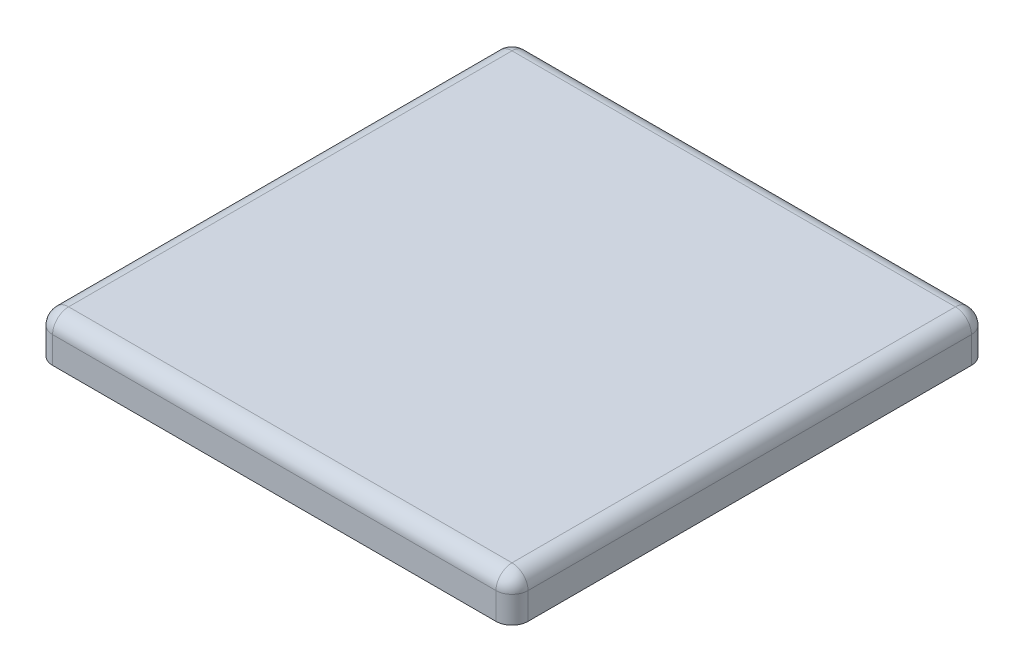
ISO-10303-21;
HEADER;
FILE_DESCRIPTION(('STEP AP214'),'2;1');
FILE_NAME('part.step','',(''),(''),'','','');
FILE_SCHEMA(('AUTOMOTIVE_DESIGN { 1 0 10303 214 1 1 1 1 }'));
ENDSEC;
DATA;
#1=APPLICATION_CONTEXT('core data for automotive mechanical design processes');
#2=APPLICATION_PROTOCOL_DEFINITION('international standard','automotive_design',2000,#1);
#3=PRODUCT_CONTEXT('',#1,'mechanical');
#4=PRODUCT('Part','Part','',(#3));
#5=PRODUCT_RELATED_PRODUCT_CATEGORY('part','',(#4));
#6=PRODUCT_DEFINITION_FORMATION('','',#4);
#7=PRODUCT_DEFINITION_CONTEXT('part definition',#1,'design');
#8=PRODUCT_DEFINITION('design','',#6,#7);
#9=PRODUCT_DEFINITION_SHAPE('','',#8);
#10=(LENGTH_UNIT() NAMED_UNIT(*) SI_UNIT(.MILLI.,.METRE.));
#11=(NAMED_UNIT(*) PLANE_ANGLE_UNIT() SI_UNIT($,.RADIAN.));
#12=(NAMED_UNIT(*) SI_UNIT($,.STERADIAN.) SOLID_ANGLE_UNIT());
#13=UNCERTAINTY_MEASURE_WITH_UNIT(LENGTH_MEASURE(1.E-05),#10,'distance_accuracy_value','');
#14=(GEOMETRIC_REPRESENTATION_CONTEXT(3) GLOBAL_UNCERTAINTY_ASSIGNED_CONTEXT((#13)) GLOBAL_UNIT_ASSIGNED_CONTEXT((#10,
#11,#12)) REPRESENTATION_CONTEXT('',''));
#15=CARTESIAN_POINT('',(0.,0.,0.));
#16=DIRECTION('',(0.,0.,1.));
#17=DIRECTION('',(1.,0.,0.));
#18=AXIS2_PLACEMENT_3D('',#15,#16,#17);
#19=CARTESIAN_POINT('',(0.,0.,0.));
#20=DIRECTION('',(0.,-1.,0.));
#21=DIRECTION('',(0.,0.,-1.));
#22=AXIS2_PLACEMENT_3D('',#19,#20,#21);
#23=PLANE('',#22);
#24=DIRECTION('',(0.,0.,1.));
#25=VECTOR('',#24,1.);
#26=CARTESIAN_POINT('',(-44.5,0.,-44.5));
#27=LINE('',#26,#25);
#28=CARTESIAN_POINT('',(-44.5,0.,-41.5));
#29=VERTEX_POINT('',#28);
#30=CARTESIAN_POINT('',(-44.5,0.,41.5));
#31=VERTEX_POINT('',#30);
#32=EDGE_CURVE('E246',#29,#31,#27,.T.);
#33=ORIENTED_EDGE('',*,*,#32,.F.);
#34=CARTESIAN_POINT('',(-41.5,0.,-41.5));
#35=DIRECTION('',(0.,-1.,0.));
#36=DIRECTION('',(0.,0.,-1.));
#37=AXIS2_PLACEMENT_3D('',#34,#35,#36);
#38=CIRCLE('',#37,3.);
#39=CARTESIAN_POINT('',(-41.5,0.,-44.5));
#40=VERTEX_POINT('',#39);
#41=EDGE_CURVE('E11',#29,#40,#38,.T.);
#42=ORIENTED_EDGE('',*,*,#41,.T.);
#43=DIRECTION('',(-1.,0.,0.));
#44=VECTOR('',#43,1.);
#45=CARTESIAN_POINT('',(44.5,0.,-44.5));
#46=LINE('',#45,#44);
#47=CARTESIAN_POINT('',(41.5,0.,-44.5));
#48=VERTEX_POINT('',#47);
#49=EDGE_CURVE('E255',#48,#40,#46,.T.);
#50=ORIENTED_EDGE('',*,*,#49,.F.);
#51=CARTESIAN_POINT('',(41.5,0.,-41.5));
#52=DIRECTION('',(0.,-1.,0.));
#53=DIRECTION('',(0.,0.,-1.));
#54=AXIS2_PLACEMENT_3D('',#51,#52,#53);
#55=CIRCLE('',#54,3.);
#56=CARTESIAN_POINT('',(44.5,0.,-41.5));
#57=VERTEX_POINT('',#56);
#58=EDGE_CURVE('E293',#48,#57,#55,.T.);
#59=ORIENTED_EDGE('',*,*,#58,.T.);
#60=DIRECTION('',(0.,0.,-1.));
#61=VECTOR('',#60,1.);
#62=CARTESIAN_POINT('',(44.5,0.,-44.5));
#63=LINE('',#62,#61);
#64=CARTESIAN_POINT('',(44.5,0.,41.5));
#65=VERTEX_POINT('',#64);
#66=EDGE_CURVE('E252',#65,#57,#63,.T.);
#67=ORIENTED_EDGE('',*,*,#66,.F.);
#68=CARTESIAN_POINT('',(41.5,0.,41.5));
#69=DIRECTION('',(0.,-1.,0.));
#70=DIRECTION('',(0.,0.,-1.));
#71=AXIS2_PLACEMENT_3D('',#68,#69,#70);
#72=CIRCLE('',#71,3.);
#73=CARTESIAN_POINT('',(41.5,0.,44.5));
#74=VERTEX_POINT('',#73);
#75=EDGE_CURVE('E291',#65,#74,#72,.T.);
#76=ORIENTED_EDGE('',*,*,#75,.T.);
#77=DIRECTION('',(1.,0.,0.));
#78=VECTOR('',#77,1.);
#79=CARTESIAN_POINT('',(44.5,0.,44.5));
#80=LINE('',#79,#78);
#81=CARTESIAN_POINT('',(-41.5,0.,44.5));
#82=VERTEX_POINT('',#81);
#83=EDGE_CURVE('E249',#82,#74,#80,.T.);
#84=ORIENTED_EDGE('',*,*,#83,.F.);
#85=CARTESIAN_POINT('',(-41.5,0.,41.5));
#86=DIRECTION('',(0.,-1.,0.));
#87=DIRECTION('',(0.,0.,-1.));
#88=AXIS2_PLACEMENT_3D('',#85,#86,#87);
#89=CIRCLE('',#88,3.);
#90=EDGE_CURVE('E43',#82,#31,#89,.T.);
#91=ORIENTED_EDGE('',*,*,#90,.T.);
#92=EDGE_LOOP('',(#33,#42,#50,#59,#67,#76,#84,#91));
#93=FACE_BOUND('',#92,.T.);
#94=CARTESIAN_POINT('',(-41.5,0.,-41.5));
#95=DIRECTION('',(0.,-1.,0.));
#96=DIRECTION('',(0.,0.,-1.));
#97=AXIS2_PLACEMENT_3D('',#94,#95,#96);
#98=CIRCLE('',#97,1.);
#99=CARTESIAN_POINT('',(-42.5,0.,-41.5));
#100=VERTEX_POINT('',#99);
#101=CARTESIAN_POINT('',(-41.5,0.,-42.5));
#102=VERTEX_POINT('',#101);
#103=EDGE_CURVE('E230',#100,#102,#98,.T.);
#104=ORIENTED_EDGE('',*,*,#103,.F.);
#105=DIRECTION('',(0.,0.,1.));
#106=VECTOR('',#105,1.);
#107=CARTESIAN_POINT('',(-42.5,0.,0.));
#108=LINE('',#107,#106);
#109=CARTESIAN_POINT('',(-42.5,0.,41.5));
#110=VERTEX_POINT('',#109);
#111=EDGE_CURVE('E191',#100,#110,#108,.T.);
#112=ORIENTED_EDGE('',*,*,#111,.T.);
#113=CARTESIAN_POINT('',(-41.5,0.,41.5));
#114=DIRECTION('',(0.,-1.,0.));
#115=DIRECTION('',(0.,0.,-1.));
#116=AXIS2_PLACEMENT_3D('',#113,#114,#115);
#117=CIRCLE('',#116,1.);
#118=CARTESIAN_POINT('',(-41.5,0.,42.5));
#119=VERTEX_POINT('',#118);
#120=EDGE_CURVE('E233',#119,#110,#117,.T.);
#121=ORIENTED_EDGE('',*,*,#120,.F.);
#122=DIRECTION('',(1.,0.,0.));
#123=VECTOR('',#122,1.);
#124=CARTESIAN_POINT('',(0.,0.,42.5));
#125=LINE('',#124,#123);
#126=CARTESIAN_POINT('',(41.5,0.,42.5));
#127=VERTEX_POINT('',#126);
#128=EDGE_CURVE('E51',#119,#127,#125,.T.);
#129=ORIENTED_EDGE('',*,*,#128,.T.);
#130=CARTESIAN_POINT('',(41.5,0.,41.5));
#131=DIRECTION('',(0.,-1.,0.));
#132=DIRECTION('',(0.,0.,-1.));
#133=AXIS2_PLACEMENT_3D('',#130,#131,#132);
#134=CIRCLE('',#133,1.);
#135=CARTESIAN_POINT('',(42.5,0.,41.5));
#136=VERTEX_POINT('',#135);
#137=EDGE_CURVE('E195',#136,#127,#134,.T.);
#138=ORIENTED_EDGE('',*,*,#137,.F.);
#139=DIRECTION('',(0.,0.,-1.));
#140=VECTOR('',#139,1.);
#141=CARTESIAN_POINT('',(42.5,0.,0.));
#142=LINE('',#141,#140);
#143=CARTESIAN_POINT('',(42.5,0.,-41.5));
#144=VERTEX_POINT('',#143);
#145=EDGE_CURVE('E238',#136,#144,#142,.T.);
#146=ORIENTED_EDGE('',*,*,#145,.T.);
#147=CARTESIAN_POINT('',(41.5,0.,-41.5));
#148=DIRECTION('',(0.,-1.,0.));
#149=DIRECTION('',(0.,0.,-1.));
#150=AXIS2_PLACEMENT_3D('',#147,#148,#149);
#151=CIRCLE('',#150,1.);
#152=CARTESIAN_POINT('',(41.5,0.,-42.5));
#153=VERTEX_POINT('',#152);
#154=EDGE_CURVE('E239',#153,#144,#151,.T.);
#155=ORIENTED_EDGE('',*,*,#154,.F.);
#156=DIRECTION('',(-1.,0.,0.));
#157=VECTOR('',#156,1.);
#158=CARTESIAN_POINT('',(0.,0.,-42.5));
#159=LINE('',#158,#157);
#160=EDGE_CURVE('E234',#153,#102,#159,.T.);
#161=ORIENTED_EDGE('',*,*,#160,.T.);
#162=EDGE_LOOP('',(#104,#112,#121,#129,#138,#146,#155,#161));
#163=FACE_BOUND('',#162,.T.);
#164=ADVANCED_FACE('F34',(#93,#163),#23,.T.);
#165=CARTESIAN_POINT('',(-44.5,8.,-44.5));
#166=DIRECTION('',(1.,0.,0.));
#167=DIRECTION('',(0.,0.,-1.));
#168=AXIS2_PLACEMENT_3D('',#165,#166,#167);
#169=PLANE('',#168);
#170=DIRECTION('',(0.,0.,1.));
#171=VECTOR('',#170,1.);
#172=CARTESIAN_POINT('',(-44.5,5.,-44.5));
#173=LINE('',#172,#171);
#174=CARTESIAN_POINT('',(-44.5,5.,41.5));
#175=VERTEX_POINT('',#174);
#176=CARTESIAN_POINT('',(-44.5,5.,-41.5));
#177=VERTEX_POINT('',#176);
#178=EDGE_CURVE('E59',#175,#177,#173,.F.);
#179=ORIENTED_EDGE('',*,*,#178,.T.);
#180=DIRECTION('',(0.,-1.,0.));
#181=VECTOR('',#180,1.);
#182=CARTESIAN_POINT('',(-44.5,8.,-41.5));
#183=LINE('',#182,#181);
#184=EDGE_CURVE('E289',#177,#29,#183,.T.);
#185=ORIENTED_EDGE('',*,*,#184,.T.);
#186=ORIENTED_EDGE('',*,*,#32,.T.);
#187=DIRECTION('',(0.,-1.,0.));
#188=VECTOR('',#187,1.);
#189=CARTESIAN_POINT('',(-44.5,8.,41.5));
#190=LINE('',#189,#188);
#191=EDGE_CURVE('E286',#31,#175,#190,.F.);
#192=ORIENTED_EDGE('',*,*,#191,.T.);
#193=EDGE_LOOP('',(#179,#185,#186,#192));
#194=FACE_BOUND('',#193,.T.);
#195=ADVANCED_FACE('F363',(#194),#169,.F.);
#196=CARTESIAN_POINT('',(44.5,8.,44.5));
#197=DIRECTION('',(0.,0.,-1.));
#198=DIRECTION('',(-1.,0.,0.));
#199=AXIS2_PLACEMENT_3D('',#196,#197,#198);
#200=PLANE('',#199);
#201=DIRECTION('',(1.,0.,0.));
#202=VECTOR('',#201,1.);
#203=CARTESIAN_POINT('',(44.5,5.,44.5));
#204=LINE('',#203,#202);
#205=CARTESIAN_POINT('',(41.5,5.,44.5));
#206=VERTEX_POINT('',#205);
#207=CARTESIAN_POINT('',(-41.5,5.,44.5));
#208=VERTEX_POINT('',#207);
#209=EDGE_CURVE('E282',#206,#208,#204,.F.);
#210=ORIENTED_EDGE('',*,*,#209,.T.);
#211=DIRECTION('',(0.,-1.,0.));
#212=VECTOR('',#211,1.);
#213=CARTESIAN_POINT('',(-41.5,8.,44.5));
#214=LINE('',#213,#212);
#215=EDGE_CURVE('E284',#208,#82,#214,.T.);
#216=ORIENTED_EDGE('',*,*,#215,.T.);
#217=ORIENTED_EDGE('',*,*,#83,.T.);
#218=DIRECTION('',(0.,-1.,0.));
#219=VECTOR('',#218,1.);
#220=CARTESIAN_POINT('',(41.5,8.,44.5));
#221=LINE('',#220,#219);
#222=EDGE_CURVE('E280',#74,#206,#221,.F.);
#223=ORIENTED_EDGE('',*,*,#222,.T.);
#224=EDGE_LOOP('',(#210,#216,#217,#223));
#225=FACE_BOUND('',#224,.T.);
#226=ADVANCED_FACE('F351',(#225),#200,.F.);
#227=CARTESIAN_POINT('',(44.5,8.,-44.5));
#228=DIRECTION('',(-1.,0.,0.));
#229=DIRECTION('',(0.,0.,1.));
#230=AXIS2_PLACEMENT_3D('',#227,#228,#229);
#231=PLANE('',#230);
#232=ORIENTED_EDGE('',*,*,#66,.T.);
#233=DIRECTION('',(0.,-1.,0.));
#234=VECTOR('',#233,1.);
#235=CARTESIAN_POINT('',(44.5,8.,-41.5));
#236=LINE('',#235,#234);
#237=CARTESIAN_POINT('',(44.5,5.,-41.5));
#238=VERTEX_POINT('',#237);
#239=EDGE_CURVE('E278',#57,#238,#236,.F.);
#240=ORIENTED_EDGE('',*,*,#239,.T.);
#241=DIRECTION('',(0.,0.,-1.));
#242=VECTOR('',#241,1.);
#243=CARTESIAN_POINT('',(44.5,5.,-44.5));
#244=LINE('',#243,#242);
#245=CARTESIAN_POINT('',(44.5,5.,41.5));
#246=VERTEX_POINT('',#245);
#247=EDGE_CURVE('E276',#238,#246,#244,.F.);
#248=ORIENTED_EDGE('',*,*,#247,.T.);
#249=DIRECTION('',(0.,-1.,0.));
#250=VECTOR('',#249,1.);
#251=CARTESIAN_POINT('',(44.5,8.,41.5));
#252=LINE('',#251,#250);
#253=EDGE_CURVE('E274',#246,#65,#252,.T.);
#254=ORIENTED_EDGE('',*,*,#253,.T.);
#255=EDGE_LOOP('',(#232,#240,#248,#254));
#256=FACE_BOUND('',#255,.T.);
#257=ADVANCED_FACE('F387',(#256),#231,.F.);
#258=CARTESIAN_POINT('',(44.5,8.,-44.5));
#259=DIRECTION('',(0.,0.,1.));
#260=DIRECTION('',(1.,0.,0.));
#261=AXIS2_PLACEMENT_3D('',#258,#259,#260);
#262=PLANE('',#261);
#263=ORIENTED_EDGE('',*,*,#49,.T.);
#264=DIRECTION('',(0.,-1.,0.));
#265=VECTOR('',#264,1.);
#266=CARTESIAN_POINT('',(-41.5,8.,-44.5));
#267=LINE('',#266,#265);
#268=CARTESIAN_POINT('',(-41.5,5.,-44.5));
#269=VERTEX_POINT('',#268);
#270=EDGE_CURVE('E272',#40,#269,#267,.F.);
#271=ORIENTED_EDGE('',*,*,#270,.T.);
#272=DIRECTION('',(-1.,0.,0.));
#273=VECTOR('',#272,1.);
#274=CARTESIAN_POINT('',(44.5,5.,-44.5));
#275=LINE('',#274,#273);
#276=CARTESIAN_POINT('',(41.5,5.,-44.5));
#277=VERTEX_POINT('',#276);
#278=EDGE_CURVE('E269',#269,#277,#275,.F.);
#279=ORIENTED_EDGE('',*,*,#278,.T.);
#280=DIRECTION('',(0.,-1.,0.));
#281=VECTOR('',#280,1.);
#282=CARTESIAN_POINT('',(41.5,8.,-44.5));
#283=LINE('',#282,#281);
#284=EDGE_CURVE('E267',#277,#48,#283,.T.);
#285=ORIENTED_EDGE('',*,*,#284,.T.);
#286=EDGE_LOOP('',(#263,#271,#279,#285));
#287=FACE_BOUND('',#286,.T.);
#288=ADVANCED_FACE('F378',(#287),#262,.F.);
#289=CARTESIAN_POINT('',(0.,8.,0.));
#290=DIRECTION('',(0.,-1.,0.));
#291=DIRECTION('',(0.,0.,-1.));
#292=AXIS2_PLACEMENT_3D('',#289,#290,#291);
#293=PLANE('',#292);
#294=DIRECTION('',(0.,0.,-1.));
#295=VECTOR('',#294,1.);
#296=CARTESIAN_POINT('',(41.5,8.,0.));
#297=LINE('',#296,#295);
#298=CARTESIAN_POINT('',(41.5,8.,41.5));
#299=VERTEX_POINT('',#298);
#300=CARTESIAN_POINT('',(41.5,8.,-41.5));
#301=VERTEX_POINT('',#300);
#302=EDGE_CURVE('E262',#299,#301,#297,.T.);
#303=ORIENTED_EDGE('',*,*,#302,.T.);
#304=DIRECTION('',(-1.,0.,0.));
#305=VECTOR('',#304,1.);
#306=CARTESIAN_POINT('',(0.,8.,-41.5));
#307=LINE('',#306,#305);
#308=CARTESIAN_POINT('',(-41.5,8.,-41.5));
#309=VERTEX_POINT('',#308);
#310=EDGE_CURVE('E264',#301,#309,#307,.T.);
#311=ORIENTED_EDGE('',*,*,#310,.T.);
#312=DIRECTION('',(0.,0.,1.));
#313=VECTOR('',#312,1.);
#314=CARTESIAN_POINT('',(-41.5,8.,0.));
#315=LINE('',#314,#313);
#316=CARTESIAN_POINT('',(-41.5,8.,41.5));
#317=VERTEX_POINT('',#316);
#318=EDGE_CURVE('E258',#309,#317,#315,.T.);
#319=ORIENTED_EDGE('',*,*,#318,.T.);
#320=DIRECTION('',(1.,0.,0.));
#321=VECTOR('',#320,1.);
#322=CARTESIAN_POINT('',(0.,8.,41.5));
#323=LINE('',#322,#321);
#324=EDGE_CURVE('E260',#317,#299,#323,.T.);
#325=ORIENTED_EDGE('',*,*,#324,.T.);
#326=EDGE_LOOP('',(#303,#311,#319,#325));
#327=FACE_BOUND('',#326,.T.);
#328=ADVANCED_FACE('F341',(#327),#293,.F.);
#329=CARTESIAN_POINT('',(41.5,8.,41.5));
#330=DIRECTION('',(0.,-1.,0.));
#331=DIRECTION('',(0.,0.,-1.));
#332=AXIS2_PLACEMENT_3D('',#329,#330,#331);
#333=CYLINDRICAL_SURFACE('',#332,3.);
#334=ORIENTED_EDGE('',*,*,#75,.F.);
#335=ORIENTED_EDGE('',*,*,#253,.F.);
#336=CARTESIAN_POINT('',(41.5,5.,41.5));
#337=DIRECTION('',(0.,1.,0.));
#338=DIRECTION('',(0.,0.,1.));
#339=AXIS2_PLACEMENT_3D('',#336,#337,#338);
#340=CIRCLE('',#339,3.);
#341=EDGE_CURVE('E38',#206,#246,#340,.T.);
#342=ORIENTED_EDGE('',*,*,#341,.F.);
#343=ORIENTED_EDGE('',*,*,#222,.F.);
#344=EDGE_LOOP('',(#334,#335,#342,#343));
#345=FACE_BOUND('',#344,.T.);
#346=ADVANCED_FACE('F36',(#345),#333,.T.);
#347=CARTESIAN_POINT('',(0.,5.,41.5));
#348=DIRECTION('',(1.,0.,0.));
#349=DIRECTION('',(0.,0.,-1.));
#350=AXIS2_PLACEMENT_3D('',#347,#348,#349);
#351=CYLINDRICAL_SURFACE('',#350,3.);
#352=CARTESIAN_POINT('',(-41.5,5.,41.5));
#353=DIRECTION('',(-1.,0.,0.));
#354=DIRECTION('',(0.,0.,1.));
#355=AXIS2_PLACEMENT_3D('',#352,#353,#354);
#356=CIRCLE('',#355,3.);
#357=EDGE_CURVE('E320',#208,#317,#356,.T.);
#358=ORIENTED_EDGE('',*,*,#357,.F.);
#359=ORIENTED_EDGE('',*,*,#209,.F.);
#360=CARTESIAN_POINT('',(41.5,5.,41.5));
#361=DIRECTION('',(1.,0.,0.));
#362=DIRECTION('',(0.,0.,-1.));
#363=AXIS2_PLACEMENT_3D('',#360,#361,#362);
#364=CIRCLE('',#363,3.);
#365=EDGE_CURVE('E322',#299,#206,#364,.T.);
#366=ORIENTED_EDGE('',*,*,#365,.F.);
#367=ORIENTED_EDGE('',*,*,#324,.F.);
#368=EDGE_LOOP('',(#358,#359,#366,#367));
#369=FACE_BOUND('',#368,.T.);
#370=ADVANCED_FACE('F348',(#369),#351,.T.);
#371=CARTESIAN_POINT('',(-41.5,8.,41.5));
#372=DIRECTION('',(0.,-1.,0.));
#373=DIRECTION('',(0.,0.,-1.));
#374=AXIS2_PLACEMENT_3D('',#371,#372,#373);
#375=CYLINDRICAL_SURFACE('',#374,3.);
#376=ORIENTED_EDGE('',*,*,#90,.F.);
#377=ORIENTED_EDGE('',*,*,#215,.F.);
#378=CARTESIAN_POINT('',(-41.5,5.,41.5));
#379=DIRECTION('',(0.,1.,0.));
#380=DIRECTION('',(0.,0.,1.));
#381=AXIS2_PLACEMENT_3D('',#378,#379,#380);
#382=CIRCLE('',#381,3.);
#383=EDGE_CURVE('E317',#175,#208,#382,.T.);
#384=ORIENTED_EDGE('',*,*,#383,.F.);
#385=ORIENTED_EDGE('',*,*,#191,.F.);
#386=EDGE_LOOP('',(#376,#377,#384,#385));
#387=FACE_BOUND('',#386,.T.);
#388=ADVANCED_FACE('F356',(#387),#375,.T.);
#389=CARTESIAN_POINT('',(41.5,5.,41.5));
#390=DIRECTION('',(0.,0.,1.));
#391=DIRECTION('',(1.,0.,0.));
#392=AXIS2_PLACEMENT_3D('',#389,#390,#391);
#393=SPHERICAL_SURFACE('',#392,3.);
#394=ORIENTED_EDGE('',*,*,#365,.T.);
#395=ORIENTED_EDGE('',*,*,#341,.T.);
#396=CARTESIAN_POINT('',(41.5,5.,41.5));
#397=DIRECTION('',(0.,0.,1.));
#398=DIRECTION('',(0.,-1.,0.));
#399=AXIS2_PLACEMENT_3D('',#396,#397,#398);
#400=CIRCLE('',#399,3.);
#401=EDGE_CURVE('E314',#299,#246,#400,.F.);
#402=ORIENTED_EDGE('',*,*,#401,.F.);
#403=EDGE_LOOP('',(#394,#395,#402));
#404=FACE_BOUND('',#403,.T.);
#405=ADVANCED_FACE('F329',(#404),#393,.T.);
#406=CARTESIAN_POINT('',(-41.5,5.,41.5));
#407=DIRECTION('',(0.,0.,1.));
#408=DIRECTION('',(1.,0.,0.));
#409=AXIS2_PLACEMENT_3D('',#406,#407,#408);
#410=SPHERICAL_SURFACE('',#409,3.);
#411=ORIENTED_EDGE('',*,*,#383,.T.);
#412=ORIENTED_EDGE('',*,*,#357,.T.);
#413=CARTESIAN_POINT('',(-41.5,5.,41.5));
#414=DIRECTION('',(0.,0.,1.));
#415=DIRECTION('',(1.,0.,0.));
#416=AXIS2_PLACEMENT_3D('',#413,#414,#415);
#417=CIRCLE('',#416,3.);
#418=EDGE_CURVE('E311',#175,#317,#417,.F.);
#419=ORIENTED_EDGE('',*,*,#418,.F.);
#420=EDGE_LOOP('',(#411,#412,#419));
#421=FACE_BOUND('',#420,.T.);
#422=ADVANCED_FACE('F425',(#421),#410,.T.);
#423=CARTESIAN_POINT('',(41.5,8.,-41.5));
#424=DIRECTION('',(0.,-1.,0.));
#425=DIRECTION('',(0.,0.,-1.));
#426=AXIS2_PLACEMENT_3D('',#423,#424,#425);
#427=CYLINDRICAL_SURFACE('',#426,3.);
#428=ORIENTED_EDGE('',*,*,#58,.F.);
#429=ORIENTED_EDGE('',*,*,#284,.F.);
#430=CARTESIAN_POINT('',(41.5,5.,-41.5));
#431=DIRECTION('',(0.,1.,0.));
#432=DIRECTION('',(0.,0.,1.));
#433=AXIS2_PLACEMENT_3D('',#430,#431,#432);
#434=CIRCLE('',#433,3.);
#435=EDGE_CURVE('E308',#238,#277,#434,.T.);
#436=ORIENTED_EDGE('',*,*,#435,.F.);
#437=ORIENTED_EDGE('',*,*,#239,.F.);
#438=EDGE_LOOP('',(#428,#429,#436,#437));
#439=FACE_BOUND('',#438,.T.);
#440=ADVANCED_FACE('F385',(#439),#427,.T.);
#441=CARTESIAN_POINT('',(41.5,5.,0.));
#442=DIRECTION('',(0.,0.,-1.));
#443=DIRECTION('',(-1.,0.,0.));
#444=AXIS2_PLACEMENT_3D('',#441,#442,#443);
#445=CYLINDRICAL_SURFACE('',#444,3.);
#446=ORIENTED_EDGE('',*,*,#401,.T.);
#447=ORIENTED_EDGE('',*,*,#247,.F.);
#448=CARTESIAN_POINT('',(41.5,5.,-41.5));
#449=DIRECTION('',(0.,0.,-1.));
#450=DIRECTION('',(-1.,0.,0.));
#451=AXIS2_PLACEMENT_3D('',#448,#449,#450);
#452=CIRCLE('',#451,3.);
#453=EDGE_CURVE('E305',#301,#238,#452,.T.);
#454=ORIENTED_EDGE('',*,*,#453,.F.);
#455=ORIENTED_EDGE('',*,*,#302,.F.);
#456=EDGE_LOOP('',(#446,#447,#454,#455));
#457=FACE_BOUND('',#456,.T.);
#458=ADVANCED_FACE('F336',(#457),#445,.T.);
#459=CARTESIAN_POINT('',(-41.5,5.,0.));
#460=DIRECTION('',(0.,0.,1.));
#461=DIRECTION('',(1.,0.,0.));
#462=AXIS2_PLACEMENT_3D('',#459,#460,#461);
#463=CYLINDRICAL_SURFACE('',#462,3.);
#464=ORIENTED_EDGE('',*,*,#418,.T.);
#465=ORIENTED_EDGE('',*,*,#318,.F.);
#466=CARTESIAN_POINT('',(-41.5,5.,-41.5));
#467=DIRECTION('',(0.,0.,-1.));
#468=DIRECTION('',(0.,1.,0.));
#469=AXIS2_PLACEMENT_3D('',#466,#467,#468);
#470=CIRCLE('',#469,3.);
#471=EDGE_CURVE('E302',#177,#309,#470,.T.);
#472=ORIENTED_EDGE('',*,*,#471,.F.);
#473=ORIENTED_EDGE('',*,*,#178,.F.);
#474=EDGE_LOOP('',(#464,#465,#472,#473));
#475=FACE_BOUND('',#474,.T.);
#476=ADVANCED_FACE('F371',(#475),#463,.T.);
#477=CARTESIAN_POINT('',(-41.5,8.,-41.5));
#478=DIRECTION('',(0.,-1.,0.));
#479=DIRECTION('',(0.,0.,-1.));
#480=AXIS2_PLACEMENT_3D('',#477,#478,#479);
#481=CYLINDRICAL_SURFACE('',#480,3.);
#482=ORIENTED_EDGE('',*,*,#41,.F.);
#483=ORIENTED_EDGE('',*,*,#184,.F.);
#484=CARTESIAN_POINT('',(-41.5,5.,-41.5));
#485=DIRECTION('',(0.,1.,0.));
#486=DIRECTION('',(0.,0.,1.));
#487=AXIS2_PLACEMENT_3D('',#484,#485,#486);
#488=CIRCLE('',#487,3.);
#489=EDGE_CURVE('E299',#269,#177,#488,.T.);
#490=ORIENTED_EDGE('',*,*,#489,.F.);
#491=ORIENTED_EDGE('',*,*,#270,.F.);
#492=EDGE_LOOP('',(#482,#483,#490,#491));
#493=FACE_BOUND('',#492,.T.);
#494=ADVANCED_FACE('F367',(#493),#481,.T.);
#495=CARTESIAN_POINT('',(41.5,5.,-41.5));
#496=DIRECTION('',(1.,0.,0.));
#497=DIRECTION('',(0.,0.,-1.));
#498=AXIS2_PLACEMENT_3D('',#495,#496,#497);
#499=SPHERICAL_SURFACE('',#498,3.);
#500=ORIENTED_EDGE('',*,*,#453,.T.);
#501=ORIENTED_EDGE('',*,*,#435,.T.);
#502=CARTESIAN_POINT('',(41.5,5.,-41.5));
#503=DIRECTION('',(1.,0.,0.));
#504=DIRECTION('',(0.,1.,0.));
#505=AXIS2_PLACEMENT_3D('',#502,#503,#504);
#506=CIRCLE('',#505,3.);
#507=EDGE_CURVE('E297',#301,#277,#506,.F.);
#508=ORIENTED_EDGE('',*,*,#507,.F.);
#509=EDGE_LOOP('',(#500,#501,#508));
#510=FACE_BOUND('',#509,.T.);
#511=ADVANCED_FACE('F413',(#510),#499,.T.);
#512=CARTESIAN_POINT('',(-41.5,5.,-41.5));
#513=DIRECTION('',(-1.,0.,0.));
#514=DIRECTION('',(0.,0.,1.));
#515=AXIS2_PLACEMENT_3D('',#512,#513,#514);
#516=SPHERICAL_SURFACE('',#515,3.);
#517=ORIENTED_EDGE('',*,*,#489,.T.);
#518=ORIENTED_EDGE('',*,*,#471,.T.);
#519=CARTESIAN_POINT('',(-41.5,5.,-41.5));
#520=DIRECTION('',(-1.,0.,0.));
#521=DIRECTION('',(0.,0.,1.));
#522=AXIS2_PLACEMENT_3D('',#519,#520,#521);
#523=CIRCLE('',#522,3.);
#524=EDGE_CURVE('E232',#269,#309,#523,.F.);
#525=ORIENTED_EDGE('',*,*,#524,.F.);
#526=EDGE_LOOP('',(#517,#518,#525));
#527=FACE_BOUND('',#526,.T.);
#528=ADVANCED_FACE('F374',(#527),#516,.T.);
#529=CARTESIAN_POINT('',(0.,5.,-41.5));
#530=DIRECTION('',(-1.,0.,0.));
#531=DIRECTION('',(0.,0.,1.));
#532=AXIS2_PLACEMENT_3D('',#529,#530,#531);
#533=CYLINDRICAL_SURFACE('',#532,3.);
#534=ORIENTED_EDGE('',*,*,#507,.T.);
#535=ORIENTED_EDGE('',*,*,#278,.F.);
#536=ORIENTED_EDGE('',*,*,#524,.T.);
#537=ORIENTED_EDGE('',*,*,#310,.F.);
#538=EDGE_LOOP('',(#534,#535,#536,#537));
#539=FACE_BOUND('',#538,.T.);
#540=ADVANCED_FACE('F376',(#539),#533,.T.);
#541=CARTESIAN_POINT('',(-42.5,8.,-44.5));
#542=DIRECTION('',(1.,0.,0.));
#543=DIRECTION('',(0.,0.,-1.));
#544=AXIS2_PLACEMENT_3D('',#541,#542,#543);
#545=PLANE('',#544);
#546=DIRECTION('',(0.,0.,-1.));
#547=VECTOR('',#546,1.);
#548=CARTESIAN_POINT('',(-42.5,5.,-44.5));
#549=LINE('',#548,#547);
#550=CARTESIAN_POINT('',(-42.5,5.,41.5));
#551=VERTEX_POINT('',#550);
#552=CARTESIAN_POINT('',(-42.5,5.,-41.5));
#553=VERTEX_POINT('',#552);
#554=EDGE_CURVE('E175',#551,#553,#549,.T.);
#555=ORIENTED_EDGE('',*,*,#554,.F.);
#556=DIRECTION('',(0.,1.,0.));
#557=VECTOR('',#556,1.);
#558=CARTESIAN_POINT('',(-42.5,8.,41.5));
#559=LINE('',#558,#557);
#560=EDGE_CURVE('E186',#110,#551,#559,.T.);
#561=ORIENTED_EDGE('',*,*,#560,.F.);
#562=ORIENTED_EDGE('',*,*,#111,.F.);
#563=DIRECTION('',(0.,1.,0.));
#564=VECTOR('',#563,1.);
#565=CARTESIAN_POINT('',(-42.5,8.,-41.5));
#566=LINE('',#565,#564);
#567=EDGE_CURVE('E185',#553,#100,#566,.F.);
#568=ORIENTED_EDGE('',*,*,#567,.F.);
#569=EDGE_LOOP('',(#555,#561,#562,#568));
#570=FACE_BOUND('',#569,.T.);
#571=ADVANCED_FACE('F189',(#570),#545,.T.);
#572=CARTESIAN_POINT('',(44.5,8.,42.5));
#573=DIRECTION('',(0.,0.,-1.));
#574=DIRECTION('',(-1.,0.,0.));
#575=AXIS2_PLACEMENT_3D('',#572,#573,#574);
#576=PLANE('',#575);
#577=DIRECTION('',(-1.,0.,0.));
#578=VECTOR('',#577,1.);
#579=CARTESIAN_POINT('',(44.5,5.,42.5));
#580=LINE('',#579,#578);
#581=CARTESIAN_POINT('',(41.5,5.,42.5));
#582=VERTEX_POINT('',#581);
#583=CARTESIAN_POINT('',(-41.5,5.,42.5));
#584=VERTEX_POINT('',#583);
#585=EDGE_CURVE('E736',#582,#584,#580,.T.);
#586=ORIENTED_EDGE('',*,*,#585,.F.);
#587=DIRECTION('',(0.,1.,0.));
#588=VECTOR('',#587,1.);
#589=CARTESIAN_POINT('',(41.5,8.,42.5));
#590=LINE('',#589,#588);
#591=EDGE_CURVE('E731',#127,#582,#590,.T.);
#592=ORIENTED_EDGE('',*,*,#591,.F.);
#593=ORIENTED_EDGE('',*,*,#128,.F.);
#594=DIRECTION('',(0.,1.,0.));
#595=VECTOR('',#594,1.);
#596=CARTESIAN_POINT('',(-41.5,8.,42.5));
#597=LINE('',#596,#595);
#598=EDGE_CURVE('E737',#584,#119,#597,.F.);
#599=ORIENTED_EDGE('',*,*,#598,.F.);
#600=EDGE_LOOP('',(#586,#592,#593,#599));
#601=FACE_BOUND('',#600,.T.);
#602=ADVANCED_FACE('F478',(#601),#576,.T.);
#603=CARTESIAN_POINT('',(42.5,8.,-44.5));
#604=DIRECTION('',(-1.,0.,0.));
#605=DIRECTION('',(0.,0.,1.));
#606=AXIS2_PLACEMENT_3D('',#603,#604,#605);
#607=PLANE('',#606);
#608=ORIENTED_EDGE('',*,*,#145,.F.);
#609=DIRECTION('',(0.,1.,0.));
#610=VECTOR('',#609,1.);
#611=CARTESIAN_POINT('',(42.5,8.,41.5));
#612=LINE('',#611,#610);
#613=CARTESIAN_POINT('',(42.5,5.,41.5));
#614=VERTEX_POINT('',#613);
#615=EDGE_CURVE('E215',#614,#136,#612,.F.);
#616=ORIENTED_EDGE('',*,*,#615,.F.);
#617=DIRECTION('',(0.,0.,1.));
#618=VECTOR('',#617,1.);
#619=CARTESIAN_POINT('',(42.5,5.,-44.5));
#620=LINE('',#619,#618);
#621=CARTESIAN_POINT('',(42.5,5.,-41.5));
#622=VERTEX_POINT('',#621);
#623=EDGE_CURVE('E727',#622,#614,#620,.T.);
#624=ORIENTED_EDGE('',*,*,#623,.F.);
#625=DIRECTION('',(0.,1.,0.));
#626=VECTOR('',#625,1.);
#627=CARTESIAN_POINT('',(42.5,8.,-41.5));
#628=LINE('',#627,#626);
#629=EDGE_CURVE('E729',#144,#622,#628,.T.);
#630=ORIENTED_EDGE('',*,*,#629,.F.);
#631=EDGE_LOOP('',(#608,#616,#624,#630));
#632=FACE_BOUND('',#631,.T.);
#633=ADVANCED_FACE('F485',(#632),#607,.T.);
#634=CARTESIAN_POINT('',(44.5,8.,-42.5));
#635=DIRECTION('',(0.,0.,1.));
#636=DIRECTION('',(1.,0.,0.));
#637=AXIS2_PLACEMENT_3D('',#634,#635,#636);
#638=PLANE('',#637);
#639=ORIENTED_EDGE('',*,*,#160,.F.);
#640=DIRECTION('',(0.,1.,0.));
#641=VECTOR('',#640,1.);
#642=CARTESIAN_POINT('',(41.5,8.,-42.5));
#643=LINE('',#642,#641);
#644=CARTESIAN_POINT('',(41.5,5.,-42.5));
#645=VERTEX_POINT('',#644);
#646=EDGE_CURVE('E219',#645,#153,#643,.F.);
#647=ORIENTED_EDGE('',*,*,#646,.F.);
#648=DIRECTION('',(1.,0.,0.));
#649=VECTOR('',#648,1.);
#650=CARTESIAN_POINT('',(44.5,5.,-42.5));
#651=LINE('',#650,#649);
#652=CARTESIAN_POINT('',(-41.5,5.,-42.5));
#653=VERTEX_POINT('',#652);
#654=EDGE_CURVE('E216',#653,#645,#651,.T.);
#655=ORIENTED_EDGE('',*,*,#654,.F.);
#656=DIRECTION('',(0.,1.,0.));
#657=VECTOR('',#656,1.);
#658=CARTESIAN_POINT('',(-41.5,8.,-42.5));
#659=LINE('',#658,#657);
#660=EDGE_CURVE('E208',#102,#653,#659,.T.);
#661=ORIENTED_EDGE('',*,*,#660,.F.);
#662=EDGE_LOOP('',(#639,#647,#655,#661));
#663=FACE_BOUND('',#662,.T.);
#664=ADVANCED_FACE('F492',(#663),#638,.T.);
#665=CARTESIAN_POINT('',(0.,6.,0.));
#666=DIRECTION('',(0.,-1.,0.));
#667=DIRECTION('',(0.,0.,-1.));
#668=AXIS2_PLACEMENT_3D('',#665,#666,#667);
#669=PLANE('',#668);
#670=DIRECTION('',(0.,0.,-1.));
#671=VECTOR('',#670,1.);
#672=CARTESIAN_POINT('',(41.5,6.,0.));
#673=LINE('',#672,#671);
#674=CARTESIAN_POINT('',(41.5,6.,41.5));
#675=VERTEX_POINT('',#674);
#676=CARTESIAN_POINT('',(41.5,6.,-41.5));
#677=VERTEX_POINT('',#676);
#678=EDGE_CURVE('E703',#675,#677,#673,.T.);
#679=ORIENTED_EDGE('',*,*,#678,.F.);
#680=DIRECTION('',(1.,0.,0.));
#681=VECTOR('',#680,1.);
#682=CARTESIAN_POINT('',(0.,6.,41.5));
#683=LINE('',#682,#681);
#684=CARTESIAN_POINT('',(-41.5,6.,41.5));
#685=VERTEX_POINT('',#684);
#686=EDGE_CURVE('E705',#685,#675,#683,.T.);
#687=ORIENTED_EDGE('',*,*,#686,.F.);
#688=DIRECTION('',(0.,0.,-1.));
#689=VECTOR('',#688,1.);
#690=CARTESIAN_POINT('',(-41.5,6.,0.));
#691=LINE('',#690,#689);
#692=CARTESIAN_POINT('',(-41.5,6.,-41.5));
#693=VERTEX_POINT('',#692);
#694=EDGE_CURVE('E237',#693,#685,#691,.F.);
#695=ORIENTED_EDGE('',*,*,#694,.F.);
#696=DIRECTION('',(1.,0.,0.));
#697=VECTOR('',#696,1.);
#698=CARTESIAN_POINT('',(0.,6.,-41.5));
#699=LINE('',#698,#697);
#700=EDGE_CURVE('E221',#677,#693,#699,.F.);
#701=ORIENTED_EDGE('',*,*,#700,.F.);
#702=EDGE_LOOP('',(#679,#687,#695,#701));
#703=FACE_BOUND('',#702,.T.);
#704=ADVANCED_FACE('F500',(#703),#669,.T.);
#705=CARTESIAN_POINT('',(41.5,8.,41.5));
#706=DIRECTION('',(0.,-1.,0.));
#707=DIRECTION('',(0.,0.,-1.));
#708=AXIS2_PLACEMENT_3D('',#705,#706,#707);
#709=CYLINDRICAL_SURFACE('',#708,1.);
#710=ORIENTED_EDGE('',*,*,#137,.T.);
#711=ORIENTED_EDGE('',*,*,#591,.T.);
#712=CARTESIAN_POINT('',(41.5,5.,41.5));
#713=DIRECTION('',(0.,-1.,0.));
#714=DIRECTION('',(0.,0.,-1.));
#715=AXIS2_PLACEMENT_3D('',#712,#713,#714);
#716=CIRCLE('',#715,1.);
#717=EDGE_CURVE('E229',#582,#614,#716,.F.);
#718=ORIENTED_EDGE('',*,*,#717,.T.);
#719=ORIENTED_EDGE('',*,*,#615,.T.);
#720=EDGE_LOOP('',(#710,#711,#718,#719));
#721=FACE_BOUND('',#720,.T.);
#722=ADVANCED_FACE('F508',(#721),#709,.F.);
#723=CARTESIAN_POINT('',(0.,5.,41.5));
#724=DIRECTION('',(1.,0.,0.));
#725=DIRECTION('',(0.,0.,-1.));
#726=AXIS2_PLACEMENT_3D('',#723,#724,#725);
#727=CYLINDRICAL_SURFACE('',#726,1.);
#728=CARTESIAN_POINT('',(-41.5,5.,41.5));
#729=DIRECTION('',(1.,0.,0.));
#730=DIRECTION('',(0.,1.,0.));
#731=AXIS2_PLACEMENT_3D('',#728,#729,#730);
#732=CIRCLE('',#731,1.);
#733=EDGE_CURVE('E711',#584,#685,#732,.F.);
#734=ORIENTED_EDGE('',*,*,#733,.T.);
#735=ORIENTED_EDGE('',*,*,#686,.T.);
#736=CARTESIAN_POINT('',(41.5,5.,41.5));
#737=DIRECTION('',(1.,0.,0.));
#738=DIRECTION('',(0.,1.,0.));
#739=AXIS2_PLACEMENT_3D('',#736,#737,#738);
#740=CIRCLE('',#739,1.);
#741=EDGE_CURVE('E713',#675,#582,#740,.T.);
#742=ORIENTED_EDGE('',*,*,#741,.T.);
#743=ORIENTED_EDGE('',*,*,#585,.T.);
#744=EDGE_LOOP('',(#734,#735,#742,#743));
#745=FACE_BOUND('',#744,.T.);
#746=ADVANCED_FACE('F516',(#745),#727,.F.);
#747=CARTESIAN_POINT('',(-41.5,8.,41.5));
#748=DIRECTION('',(0.,-1.,0.));
#749=DIRECTION('',(0.,0.,-1.));
#750=AXIS2_PLACEMENT_3D('',#747,#748,#749);
#751=CYLINDRICAL_SURFACE('',#750,1.);
#752=ORIENTED_EDGE('',*,*,#120,.T.);
#753=ORIENTED_EDGE('',*,*,#560,.T.);
#754=CARTESIAN_POINT('',(-41.5,5.,41.5));
#755=DIRECTION('',(0.,1.,0.));
#756=DIRECTION('',(-1.,0.,0.));
#757=AXIS2_PLACEMENT_3D('',#754,#755,#756);
#758=CIRCLE('',#757,1.);
#759=EDGE_CURVE('E714',#551,#584,#758,.T.);
#760=ORIENTED_EDGE('',*,*,#759,.T.);
#761=ORIENTED_EDGE('',*,*,#598,.T.);
#762=EDGE_LOOP('',(#752,#753,#760,#761));
#763=FACE_BOUND('',#762,.T.);
#764=ADVANCED_FACE('F524',(#763),#751,.F.);
#765=CARTESIAN_POINT('',(41.5,5.,41.5));
#766=DIRECTION('',(0.,0.,1.));
#767=DIRECTION('',(1.,0.,0.));
#768=AXIS2_PLACEMENT_3D('',#765,#766,#767);
#769=SPHERICAL_SURFACE('',#768,1.);
#770=ORIENTED_EDGE('',*,*,#741,.F.);
#771=CARTESIAN_POINT('',(41.5,5.,41.5));
#772=DIRECTION('',(0.,0.,-1.));
#773=DIRECTION('',(-1.,0.,0.));
#774=AXIS2_PLACEMENT_3D('',#771,#772,#773);
#775=CIRCLE('',#774,1.);
#776=EDGE_CURVE('E715',#675,#614,#775,.T.);
#777=ORIENTED_EDGE('',*,*,#776,.T.);
#778=ORIENTED_EDGE('',*,*,#717,.F.);
#779=EDGE_LOOP('',(#770,#777,#778));
#780=FACE_BOUND('',#779,.T.);
#781=ADVANCED_FACE('F532',(#780),#769,.F.);
#782=CARTESIAN_POINT('',(-41.5,5.,41.5));
#783=DIRECTION('',(0.,0.,1.));
#784=DIRECTION('',(1.,0.,0.));
#785=AXIS2_PLACEMENT_3D('',#782,#783,#784);
#786=SPHERICAL_SURFACE('',#785,1.);
#787=ORIENTED_EDGE('',*,*,#759,.F.);
#788=CARTESIAN_POINT('',(-41.5,5.,41.5));
#789=DIRECTION('',(0.,0.,1.));
#790=DIRECTION('',(1.,0.,0.));
#791=AXIS2_PLACEMENT_3D('',#788,#789,#790);
#792=CIRCLE('',#791,1.);
#793=EDGE_CURVE('E182',#551,#685,#792,.F.);
#794=ORIENTED_EDGE('',*,*,#793,.T.);
#795=ORIENTED_EDGE('',*,*,#733,.F.);
#796=EDGE_LOOP('',(#787,#794,#795));
#797=FACE_BOUND('',#796,.T.);
#798=ADVANCED_FACE('F540',(#797),#786,.F.);
#799=CARTESIAN_POINT('',(41.5,8.,-41.5));
#800=DIRECTION('',(0.,-1.,0.));
#801=DIRECTION('',(0.,0.,-1.));
#802=AXIS2_PLACEMENT_3D('',#799,#800,#801);
#803=CYLINDRICAL_SURFACE('',#802,1.);
#804=ORIENTED_EDGE('',*,*,#154,.T.);
#805=ORIENTED_EDGE('',*,*,#629,.T.);
#806=CARTESIAN_POINT('',(41.5,5.,-41.5));
#807=DIRECTION('',(0.,-1.,0.));
#808=DIRECTION('',(0.,0.,-1.));
#809=AXIS2_PLACEMENT_3D('',#806,#807,#808);
#810=CIRCLE('',#809,1.);
#811=EDGE_CURVE('E222',#622,#645,#810,.F.);
#812=ORIENTED_EDGE('',*,*,#811,.T.);
#813=ORIENTED_EDGE('',*,*,#646,.T.);
#814=EDGE_LOOP('',(#804,#805,#812,#813));
#815=FACE_BOUND('',#814,.T.);
#816=ADVANCED_FACE('F548',(#815),#803,.F.);
#817=CARTESIAN_POINT('',(41.5,5.,0.));
#818=DIRECTION('',(0.,0.,-1.));
#819=DIRECTION('',(-1.,0.,0.));
#820=AXIS2_PLACEMENT_3D('',#817,#818,#819);
#821=CYLINDRICAL_SURFACE('',#820,1.);
#822=ORIENTED_EDGE('',*,*,#776,.F.);
#823=ORIENTED_EDGE('',*,*,#678,.T.);
#824=CARTESIAN_POINT('',(41.5,5.,-41.5));
#825=DIRECTION('',(0.,0.,-1.));
#826=DIRECTION('',(0.,1.,0.));
#827=AXIS2_PLACEMENT_3D('',#824,#825,#826);
#828=CIRCLE('',#827,1.);
#829=EDGE_CURVE('E204',#677,#622,#828,.T.);
#830=ORIENTED_EDGE('',*,*,#829,.T.);
#831=ORIENTED_EDGE('',*,*,#623,.T.);
#832=EDGE_LOOP('',(#822,#823,#830,#831));
#833=FACE_BOUND('',#832,.T.);
#834=ADVANCED_FACE('F556',(#833),#821,.F.);
#835=CARTESIAN_POINT('',(-41.5,5.,0.));
#836=DIRECTION('',(0.,0.,1.));
#837=DIRECTION('',(1.,0.,0.));
#838=AXIS2_PLACEMENT_3D('',#835,#836,#837);
#839=CYLINDRICAL_SURFACE('',#838,1.);
#840=ORIENTED_EDGE('',*,*,#793,.F.);
#841=ORIENTED_EDGE('',*,*,#554,.T.);
#842=CARTESIAN_POINT('',(-41.5,5.,-41.5));
#843=DIRECTION('',(0.,0.,1.));
#844=DIRECTION('',(0.,-1.,0.));
#845=AXIS2_PLACEMENT_3D('',#842,#843,#844);
#846=CIRCLE('',#845,1.);
#847=EDGE_CURVE('E179',#553,#693,#846,.F.);
#848=ORIENTED_EDGE('',*,*,#847,.T.);
#849=ORIENTED_EDGE('',*,*,#694,.T.);
#850=EDGE_LOOP('',(#840,#841,#848,#849));
#851=FACE_BOUND('',#850,.T.);
#852=ADVANCED_FACE('F177',(#851),#839,.F.);
#853=CARTESIAN_POINT('',(-41.5,8.,-41.5));
#854=DIRECTION('',(0.,-1.,0.));
#855=DIRECTION('',(0.,0.,-1.));
#856=AXIS2_PLACEMENT_3D('',#853,#854,#855);
#857=CYLINDRICAL_SURFACE('',#856,1.);
#858=ORIENTED_EDGE('',*,*,#103,.T.);
#859=ORIENTED_EDGE('',*,*,#660,.T.);
#860=CARTESIAN_POINT('',(-41.5,5.,-41.5));
#861=DIRECTION('',(0.,1.,0.));
#862=DIRECTION('',(0.,0.,1.));
#863=AXIS2_PLACEMENT_3D('',#860,#861,#862);
#864=CIRCLE('',#863,1.);
#865=EDGE_CURVE('E200',#653,#553,#864,.T.);
#866=ORIENTED_EDGE('',*,*,#865,.T.);
#867=ORIENTED_EDGE('',*,*,#567,.T.);
#868=EDGE_LOOP('',(#858,#859,#866,#867));
#869=FACE_BOUND('',#868,.T.);
#870=ADVANCED_FACE('F206',(#869),#857,.F.);
#871=CARTESIAN_POINT('',(41.5,5.,-41.5));
#872=DIRECTION('',(1.,0.,0.));
#873=DIRECTION('',(0.,0.,-1.));
#874=AXIS2_PLACEMENT_3D('',#871,#872,#873);
#875=SPHERICAL_SURFACE('',#874,1.);
#876=ORIENTED_EDGE('',*,*,#829,.F.);
#877=CARTESIAN_POINT('',(41.5,5.,-41.5));
#878=DIRECTION('',(-1.,0.,0.));
#879=DIRECTION('',(0.,0.,1.));
#880=AXIS2_PLACEMENT_3D('',#877,#878,#879);
#881=CIRCLE('',#880,1.);
#882=EDGE_CURVE('E209',#677,#645,#881,.T.);
#883=ORIENTED_EDGE('',*,*,#882,.T.);
#884=ORIENTED_EDGE('',*,*,#811,.F.);
#885=EDGE_LOOP('',(#876,#883,#884));
#886=FACE_BOUND('',#885,.T.);
#887=ADVANCED_FACE('F577',(#886),#875,.F.);
#888=CARTESIAN_POINT('',(-41.5,5.,-41.5));
#889=DIRECTION('',(-1.,0.,0.));
#890=DIRECTION('',(0.,0.,1.));
#891=AXIS2_PLACEMENT_3D('',#888,#889,#890);
#892=SPHERICAL_SURFACE('',#891,1.);
#893=ORIENTED_EDGE('',*,*,#865,.F.);
#894=CARTESIAN_POINT('',(-41.5,5.,-41.5));
#895=DIRECTION('',(-1.,0.,0.));
#896=DIRECTION('',(0.,0.,1.));
#897=AXIS2_PLACEMENT_3D('',#894,#895,#896);
#898=CIRCLE('',#897,1.);
#899=EDGE_CURVE('E203',#653,#693,#898,.F.);
#900=ORIENTED_EDGE('',*,*,#899,.T.);
#901=ORIENTED_EDGE('',*,*,#847,.F.);
#902=EDGE_LOOP('',(#893,#900,#901));
#903=FACE_BOUND('',#902,.T.);
#904=ADVANCED_FACE('F199',(#903),#892,.F.);
#905=CARTESIAN_POINT('',(0.,5.,-41.5));
#906=DIRECTION('',(-1.,0.,0.));
#907=DIRECTION('',(0.,0.,1.));
#908=AXIS2_PLACEMENT_3D('',#905,#906,#907);
#909=CYLINDRICAL_SURFACE('',#908,1.);
#910=ORIENTED_EDGE('',*,*,#882,.F.);
#911=ORIENTED_EDGE('',*,*,#700,.T.);
#912=ORIENTED_EDGE('',*,*,#899,.F.);
#913=ORIENTED_EDGE('',*,*,#654,.T.);
#914=EDGE_LOOP('',(#910,#911,#912,#913));
#915=FACE_BOUND('',#914,.T.);
#916=ADVANCED_FACE('F591',(#915),#909,.F.);
#917=CLOSED_SHELL('',(#164,#195,#226,#257,#288,#328,#346,#370,#388,#405,#422,#440,#458,#476,
#494,#511,#528,#540,#571,#602,#633,#664,#704,#722,#746,#764,#781,#798,#816,#834,#852,#870,#887,
#904,#916));
#918=MANIFOLD_SOLID_BREP('B2',#917);
#919=ADVANCED_BREP_SHAPE_REPRESENTATION('',(#18,#918),#14);
#920=SHAPE_DEFINITION_REPRESENTATION(#9,#919);
ENDSEC;
END-ISO-10303-21;
